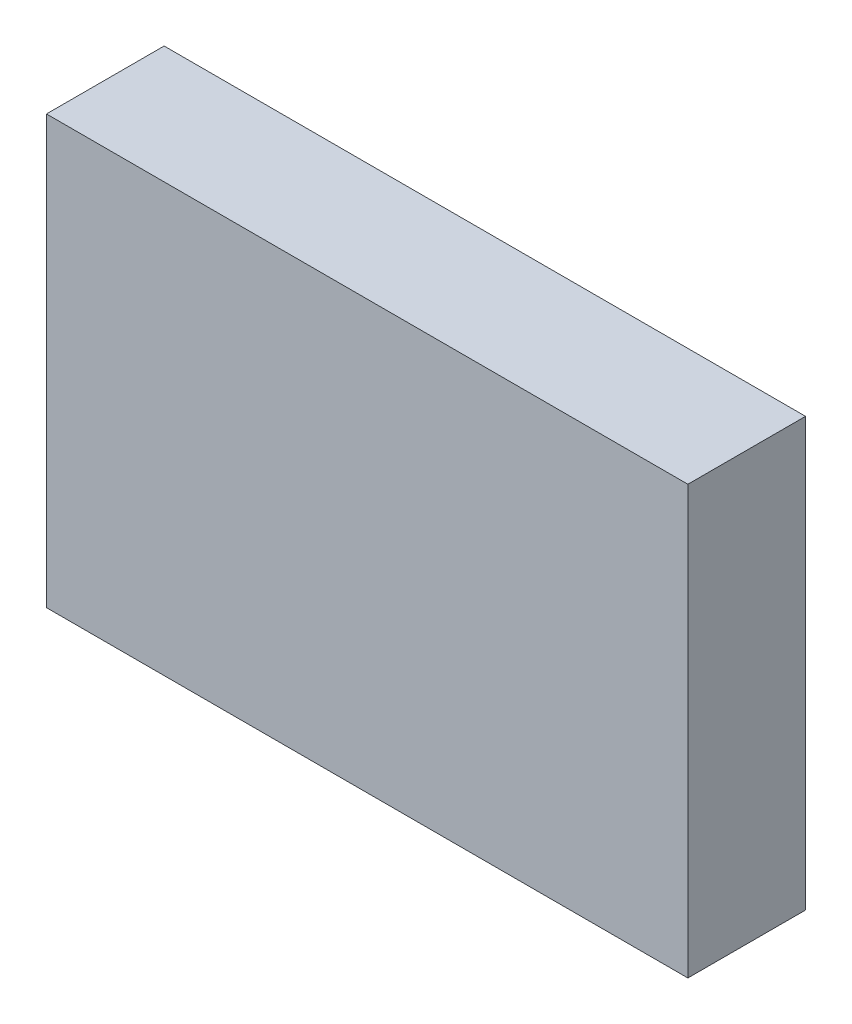
ISO-10303-21;
HEADER;
FILE_DESCRIPTION(('STEP AP214'),'2;1');
FILE_NAME('part.step','',(''),(''),'','','');
FILE_SCHEMA(('AUTOMOTIVE_DESIGN { 1 0 10303 214 1 1 1 1 }'));
ENDSEC;
DATA;
#1=APPLICATION_CONTEXT('core data for automotive mechanical design processes');
#2=APPLICATION_PROTOCOL_DEFINITION('international standard','automotive_design',2000,#1);
#3=PRODUCT_CONTEXT('',#1,'mechanical');
#4=PRODUCT('Part','Part','',(#3));
#5=PRODUCT_RELATED_PRODUCT_CATEGORY('part','',(#4));
#6=PRODUCT_DEFINITION_FORMATION('','',#4);
#7=PRODUCT_DEFINITION_CONTEXT('part definition',#1,'design');
#8=PRODUCT_DEFINITION('design','',#6,#7);
#9=PRODUCT_DEFINITION_SHAPE('','',#8);
#10=(LENGTH_UNIT() NAMED_UNIT(*) SI_UNIT(.MILLI.,.METRE.));
#11=(NAMED_UNIT(*) PLANE_ANGLE_UNIT() SI_UNIT($,.RADIAN.));
#12=(NAMED_UNIT(*) SI_UNIT($,.STERADIAN.) SOLID_ANGLE_UNIT());
#13=UNCERTAINTY_MEASURE_WITH_UNIT(LENGTH_MEASURE(1.E-05),#10,'distance_accuracy_value','');
#14=(GEOMETRIC_REPRESENTATION_CONTEXT(3) GLOBAL_UNCERTAINTY_ASSIGNED_CONTEXT((#13)) GLOBAL_UNIT_ASSIGNED_CONTEXT((#10,
#11,#12)) REPRESENTATION_CONTEXT('',''));
#15=CARTESIAN_POINT('',(0.,0.,0.));
#16=DIRECTION('',(0.,0.,1.));
#17=DIRECTION('',(1.,0.,0.));
#18=AXIS2_PLACEMENT_3D('',#15,#16,#17);
#19=CARTESIAN_POINT('',(-90.,-60.,33.02));
#20=DIRECTION('',(1.,0.,0.));
#21=DIRECTION('',(0.,0.,-1.));
#22=AXIS2_PLACEMENT_3D('',#19,#20,#21);
#23=PLANE('',#22);
#24=DIRECTION('',(0.,-1.,0.));
#25=VECTOR('',#24,1.);
#26=CARTESIAN_POINT('',(-90.,-60.,0.));
#27=LINE('',#26,#25);
#28=CARTESIAN_POINT('',(-90.,60.,0.));
#29=VERTEX_POINT('',#28);
#30=CARTESIAN_POINT('',(-90.,-60.,0.));
#31=VERTEX_POINT('',#30);
#32=EDGE_CURVE('E100',#29,#31,#27,.T.);
#33=ORIENTED_EDGE('',*,*,#32,.T.);
#34=DIRECTION('',(0.,0.,-1.));
#35=VECTOR('',#34,1.);
#36=CARTESIAN_POINT('',(-90.,-60.,33.02));
#37=LINE('',#36,#35);
#38=CARTESIAN_POINT('',(-90.,-60.,33.02));
#39=VERTEX_POINT('',#38);
#40=EDGE_CURVE('E11',#39,#31,#37,.T.);
#41=ORIENTED_EDGE('',*,*,#40,.F.);
#42=DIRECTION('',(0.,-1.,0.));
#43=VECTOR('',#42,1.);
#44=CARTESIAN_POINT('',(-90.,-60.,33.02));
#45=LINE('',#44,#43);
#46=CARTESIAN_POINT('',(-90.,60.,33.02));
#47=VERTEX_POINT('',#46);
#48=EDGE_CURVE('E88',#47,#39,#45,.T.);
#49=ORIENTED_EDGE('',*,*,#48,.F.);
#50=DIRECTION('',(0.,0.,-1.));
#51=VECTOR('',#50,1.);
#52=CARTESIAN_POINT('',(-90.,60.,33.02));
#53=LINE('',#52,#51);
#54=EDGE_CURVE('E96',#47,#29,#53,.T.);
#55=ORIENTED_EDGE('',*,*,#54,.T.);
#56=EDGE_LOOP('',(#33,#41,#49,#55));
#57=FACE_BOUND('',#56,.T.);
#58=ADVANCED_FACE('F37',(#57),#23,.F.);
#59=CARTESIAN_POINT('',(90.,-60.,33.02));
#60=DIRECTION('',(0.,1.,0.));
#61=DIRECTION('',(-1.,0.,0.));
#62=AXIS2_PLACEMENT_3D('',#59,#60,#61);
#63=PLANE('',#62);
#64=DIRECTION('',(1.,0.,0.));
#65=VECTOR('',#64,1.);
#66=CARTESIAN_POINT('',(90.,-60.,0.));
#67=LINE('',#66,#65);
#68=CARTESIAN_POINT('',(90.,-60.,0.));
#69=VERTEX_POINT('',#68);
#70=EDGE_CURVE('E92',#31,#69,#67,.T.);
#71=ORIENTED_EDGE('',*,*,#70,.T.);
#72=DIRECTION('',(0.,0.,-1.));
#73=VECTOR('',#72,1.);
#74=CARTESIAN_POINT('',(90.,-60.,33.02));
#75=LINE('',#74,#73);
#76=CARTESIAN_POINT('',(90.,-60.,33.02));
#77=VERTEX_POINT('',#76);
#78=EDGE_CURVE('E45',#77,#69,#75,.T.);
#79=ORIENTED_EDGE('',*,*,#78,.F.);
#80=DIRECTION('',(1.,0.,0.));
#81=VECTOR('',#80,1.);
#82=CARTESIAN_POINT('',(90.,-60.,33.02));
#83=LINE('',#82,#81);
#84=EDGE_CURVE('E83',#39,#77,#83,.T.);
#85=ORIENTED_EDGE('',*,*,#84,.F.);
#86=ORIENTED_EDGE('',*,*,#40,.T.);
#87=EDGE_LOOP('',(#71,#79,#85,#86));
#88=FACE_BOUND('',#87,.T.);
#89=ADVANCED_FACE('F91',(#88),#63,.F.);
#90=CARTESIAN_POINT('',(90.,-60.,33.02));
#91=DIRECTION('',(-1.,0.,0.));
#92=DIRECTION('',(0.,0.,1.));
#93=AXIS2_PLACEMENT_3D('',#90,#91,#92);
#94=PLANE('',#93);
#95=DIRECTION('',(0.,1.,0.));
#96=VECTOR('',#95,1.);
#97=CARTESIAN_POINT('',(90.,-60.,0.));
#98=LINE('',#97,#96);
#99=CARTESIAN_POINT('',(90.,60.,0.));
#100=VERTEX_POINT('',#99);
#101=EDGE_CURVE('E70',#69,#100,#98,.T.);
#102=ORIENTED_EDGE('',*,*,#101,.T.);
#103=DIRECTION('',(0.,0.,-1.));
#104=VECTOR('',#103,1.);
#105=CARTESIAN_POINT('',(90.,60.,33.02));
#106=LINE('',#105,#104);
#107=CARTESIAN_POINT('',(90.,60.,33.02));
#108=VERTEX_POINT('',#107);
#109=EDGE_CURVE('E93',#108,#100,#106,.T.);
#110=ORIENTED_EDGE('',*,*,#109,.F.);
#111=DIRECTION('',(0.,1.,0.));
#112=VECTOR('',#111,1.);
#113=CARTESIAN_POINT('',(90.,-60.,33.02));
#114=LINE('',#113,#112);
#115=EDGE_CURVE('E86',#77,#108,#114,.T.);
#116=ORIENTED_EDGE('',*,*,#115,.F.);
#117=ORIENTED_EDGE('',*,*,#78,.T.);
#118=EDGE_LOOP('',(#102,#110,#116,#117));
#119=FACE_BOUND('',#118,.T.);
#120=ADVANCED_FACE('F94',(#119),#94,.F.);
#121=CARTESIAN_POINT('',(90.,60.,33.02));
#122=DIRECTION('',(0.,-1.,0.));
#123=DIRECTION('',(1.,0.,0.));
#124=AXIS2_PLACEMENT_3D('',#121,#122,#123);
#125=PLANE('',#124);
#126=DIRECTION('',(-1.,0.,0.));
#127=VECTOR('',#126,1.);
#128=CARTESIAN_POINT('',(90.,60.,0.));
#129=LINE('',#128,#127);
#130=EDGE_CURVE('E76',#100,#29,#129,.T.);
#131=ORIENTED_EDGE('',*,*,#130,.T.);
#132=ORIENTED_EDGE('',*,*,#54,.F.);
#133=DIRECTION('',(-1.,0.,0.));
#134=VECTOR('',#133,1.);
#135=CARTESIAN_POINT('',(90.,60.,33.02));
#136=LINE('',#135,#134);
#137=EDGE_CURVE('E53',#108,#47,#136,.T.);
#138=ORIENTED_EDGE('',*,*,#137,.F.);
#139=ORIENTED_EDGE('',*,*,#109,.T.);
#140=EDGE_LOOP('',(#131,#132,#138,#139));
#141=FACE_BOUND('',#140,.T.);
#142=ADVANCED_FACE('F107',(#141),#125,.F.);
#143=CARTESIAN_POINT('',(0.,0.,33.02));
#144=DIRECTION('',(0.,0.,1.));
#145=DIRECTION('',(1.,0.,0.));
#146=AXIS2_PLACEMENT_3D('',#143,#144,#145);
#147=PLANE('',#146);
#148=ORIENTED_EDGE('',*,*,#48,.T.);
#149=ORIENTED_EDGE('',*,*,#84,.T.);
#150=ORIENTED_EDGE('',*,*,#115,.T.);
#151=ORIENTED_EDGE('',*,*,#137,.T.);
#152=EDGE_LOOP('',(#148,#149,#150,#151));
#153=FACE_BOUND('',#152,.T.);
#154=ADVANCED_FACE('F84',(#153),#147,.T.);
#155=CARTESIAN_POINT('',(0.,0.,0.));
#156=DIRECTION('',(0.,0.,1.));
#157=DIRECTION('',(1.,0.,0.));
#158=AXIS2_PLACEMENT_3D('',#155,#156,#157);
#159=PLANE('',#158);
#160=ORIENTED_EDGE('',*,*,#32,.F.);
#161=ORIENTED_EDGE('',*,*,#130,.F.);
#162=ORIENTED_EDGE('',*,*,#101,.F.);
#163=ORIENTED_EDGE('',*,*,#70,.F.);
#164=EDGE_LOOP('',(#160,#161,#162,#163));
#165=FACE_BOUND('',#164,.T.);
#166=ADVANCED_FACE('F110',(#165),#159,.F.);
#167=CLOSED_SHELL('',(#58,#89,#120,#142,#154,#166));
#168=MANIFOLD_SOLID_BREP('B2',#167);
#169=ADVANCED_BREP_SHAPE_REPRESENTATION('',(#18,#168),#14);
#170=SHAPE_DEFINITION_REPRESENTATION(#9,#169);
ENDSEC;
END-ISO-10303-21;
